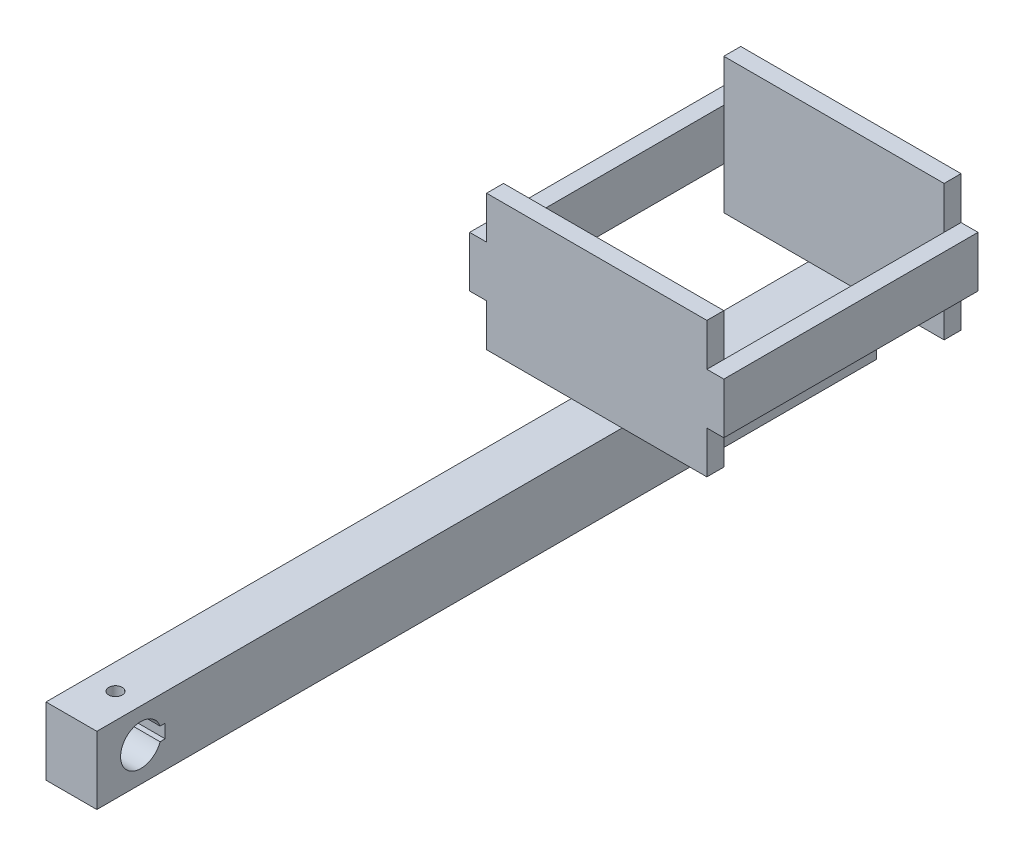
ISO-10303-21;
HEADER;
FILE_DESCRIPTION(('STEP AP214'),'2;1');
FILE_NAME('part.step','',(''),(''),'','','');
FILE_SCHEMA(('AUTOMOTIVE_DESIGN { 1 0 10303 214 1 1 1 1 }'));
ENDSEC;
DATA;
#1=APPLICATION_CONTEXT('core data for automotive mechanical design processes');
#2=APPLICATION_PROTOCOL_DEFINITION('international standard','automotive_design',2000,#1);
#3=PRODUCT_CONTEXT('',#1,'mechanical');
#4=PRODUCT('Part','Part','',(#3));
#5=PRODUCT_RELATED_PRODUCT_CATEGORY('part','',(#4));
#6=PRODUCT_DEFINITION_FORMATION('','',#4);
#7=PRODUCT_DEFINITION_CONTEXT('part definition',#1,'design');
#8=PRODUCT_DEFINITION('design','',#6,#7);
#9=PRODUCT_DEFINITION_SHAPE('','',#8);
#10=(LENGTH_UNIT() NAMED_UNIT(*) SI_UNIT(.MILLI.,.METRE.));
#11=(NAMED_UNIT(*) PLANE_ANGLE_UNIT() SI_UNIT($,.RADIAN.));
#12=(NAMED_UNIT(*) SI_UNIT($,.STERADIAN.) SOLID_ANGLE_UNIT());
#13=UNCERTAINTY_MEASURE_WITH_UNIT(LENGTH_MEASURE(1.E-05),#10,'distance_accuracy_value','');
#14=(GEOMETRIC_REPRESENTATION_CONTEXT(3) GLOBAL_UNCERTAINTY_ASSIGNED_CONTEXT((#13)) GLOBAL_UNIT_ASSIGNED_CONTEXT((#10,
#11,#12)) REPRESENTATION_CONTEXT('',''));
#15=CARTESIAN_POINT('',(0.,0.,0.));
#16=DIRECTION('',(0.,0.,1.));
#17=DIRECTION('',(1.,0.,0.));
#18=AXIS2_PLACEMENT_3D('',#15,#16,#17);
#19=CARTESIAN_POINT('',(-7.5,10.,230.));
#20=DIRECTION('',(0.,-1.,0.));
#21=DIRECTION('',(0.,0.,-1.));
#22=AXIS2_PLACEMENT_3D('',#19,#20,#21);
#23=PLANE('',#22);
#24=DIRECTION('',(1.,0.,0.));
#25=VECTOR('',#24,1.);
#26=CARTESIAN_POINT('',(-32.5,10.,70.));
#27=LINE('',#26,#25);
#28=CARTESIAN_POINT('',(-7.5,10.,70.));
#29=VERTEX_POINT('',#28);
#30=CARTESIAN_POINT('',(7.5,10.,70.));
#31=VERTEX_POINT('',#30);
#32=EDGE_CURVE('E311',#29,#31,#27,.T.);
#33=ORIENTED_EDGE('',*,*,#32,.T.);
#34=DIRECTION('',(0.,0.,-1.));
#35=VECTOR('',#34,1.);
#36=CARTESIAN_POINT('',(7.5,10.,230.));
#37=LINE('',#36,#35);
#38=CARTESIAN_POINT('',(7.5,10.,5.));
#39=VERTEX_POINT('',#38);
#40=EDGE_CURVE('E533',#31,#39,#37,.T.);
#41=ORIENTED_EDGE('',*,*,#40,.T.);
#42=DIRECTION('',(-1.,0.,0.));
#43=VECTOR('',#42,1.);
#44=CARTESIAN_POINT('',(32.5,10.,5.));
#45=LINE('',#44,#43);
#46=CARTESIAN_POINT('',(-7.5,10.,5.));
#47=VERTEX_POINT('',#46);
#48=EDGE_CURVE('E450',#39,#47,#45,.T.);
#49=ORIENTED_EDGE('',*,*,#48,.T.);
#50=DIRECTION('',(0.,0.,-1.));
#51=VECTOR('',#50,1.);
#52=CARTESIAN_POINT('',(-7.5,10.,230.));
#53=LINE('',#52,#51);
#54=EDGE_CURVE('E529',#29,#47,#53,.T.);
#55=ORIENTED_EDGE('',*,*,#54,.F.);
#56=EDGE_LOOP('',(#33,#41,#49,#55));
#57=FACE_BOUND('',#56,.T.);
#58=ADVANCED_FACE('F39',(#57),#23,.F.);
#59=CARTESIAN_POINT('',(32.5,0.,0.));
#60=DIRECTION('',(-1.,0.,0.));
#61=DIRECTION('',(0.,-1.,0.));
#62=AXIS2_PLACEMENT_3D('',#59,#60,#61);
#63=PLANE('',#62);
#64=DIRECTION('',(0.,0.,-1.));
#65=VECTOR('',#64,1.);
#66=CARTESIAN_POINT('',(32.5,22.5,0.));
#67=LINE('',#66,#65);
#68=CARTESIAN_POINT('',(32.5,22.5,70.));
#69=VERTEX_POINT('',#68);
#70=CARTESIAN_POINT('',(32.5,22.5,5.));
#71=VERTEX_POINT('',#70);
#72=EDGE_CURVE('E418',#69,#71,#67,.T.);
#73=ORIENTED_EDGE('',*,*,#72,.F.);
#74=DIRECTION('',(0.,1.,0.));
#75=VECTOR('',#74,1.);
#76=CARTESIAN_POINT('',(32.5,50.,70.));
#77=LINE('',#76,#75);
#78=CARTESIAN_POINT('',(32.5,37.5,70.));
#79=VERTEX_POINT('',#78);
#80=EDGE_CURVE('E317',#69,#79,#77,.T.);
#81=ORIENTED_EDGE('',*,*,#80,.T.);
#82=DIRECTION('',(0.,0.,1.));
#83=VECTOR('',#82,1.);
#84=CARTESIAN_POINT('',(32.5,37.5,0.));
#85=LINE('',#84,#83);
#86=CARTESIAN_POINT('',(32.5,37.5,5.));
#87=VERTEX_POINT('',#86);
#88=EDGE_CURVE('E419',#87,#79,#85,.T.);
#89=ORIENTED_EDGE('',*,*,#88,.F.);
#90=DIRECTION('',(0.,-1.,0.));
#91=VECTOR('',#90,1.);
#92=CARTESIAN_POINT('',(32.5,10.,5.));
#93=LINE('',#92,#91);
#94=EDGE_CURVE('E443',#87,#71,#93,.T.);
#95=ORIENTED_EDGE('',*,*,#94,.T.);
#96=EDGE_LOOP('',(#73,#81,#89,#95));
#97=FACE_BOUND('',#96,.T.);
#98=ADVANCED_FACE('F705',(#97),#63,.T.);
#99=CARTESIAN_POINT('',(-32.5,0.,0.));
#100=DIRECTION('',(-1.,0.,0.));
#101=DIRECTION('',(0.,0.,1.));
#102=AXIS2_PLACEMENT_3D('',#99,#100,#101);
#103=PLANE('',#102);
#104=DIRECTION('',(0.,-1.,0.));
#105=VECTOR('',#104,1.);
#106=CARTESIAN_POINT('',(-32.5,50.,70.));
#107=LINE('',#106,#105);
#108=CARTESIAN_POINT('',(-32.5,37.5,70.));
#109=VERTEX_POINT('',#108);
#110=CARTESIAN_POINT('',(-32.5,22.5,70.));
#111=VERTEX_POINT('',#110);
#112=EDGE_CURVE('E305',#109,#111,#107,.T.);
#113=ORIENTED_EDGE('',*,*,#112,.T.);
#114=DIRECTION('',(0.,0.,1.));
#115=VECTOR('',#114,1.);
#116=CARTESIAN_POINT('',(-32.5,22.5,0.));
#117=LINE('',#116,#115);
#118=CARTESIAN_POINT('',(-32.5,22.5,5.));
#119=VERTEX_POINT('',#118);
#120=EDGE_CURVE('E362',#119,#111,#117,.T.);
#121=ORIENTED_EDGE('',*,*,#120,.F.);
#122=DIRECTION('',(0.,1.,0.));
#123=VECTOR('',#122,1.);
#124=CARTESIAN_POINT('',(-32.5,10.,5.));
#125=LINE('',#124,#123);
#126=CARTESIAN_POINT('',(-32.5,37.5,5.));
#127=VERTEX_POINT('',#126);
#128=EDGE_CURVE('E455',#119,#127,#125,.T.);
#129=ORIENTED_EDGE('',*,*,#128,.T.);
#130=DIRECTION('',(0.,0.,-1.));
#131=VECTOR('',#130,1.);
#132=CARTESIAN_POINT('',(-32.5,37.5,0.));
#133=LINE('',#132,#131);
#134=EDGE_CURVE('E57',#109,#127,#133,.T.);
#135=ORIENTED_EDGE('',*,*,#134,.F.);
#136=EDGE_LOOP('',(#113,#121,#129,#135));
#137=FACE_BOUND('',#136,.T.);
#138=ADVANCED_FACE('F629',(#137),#103,.F.);
#139=CARTESIAN_POINT('',(-32.5,10.,5.));
#140=DIRECTION('',(-1.,0.,0.));
#141=DIRECTION('',(0.,0.,1.));
#142=AXIS2_PLACEMENT_3D('',#139,#140,#141);
#143=PLANE('',#142);
#144=CARTESIAN_POINT('',(-32.5,37.5,0.));
#145=VERTEX_POINT('',#144);
#146=EDGE_CURVE('E11',#127,#145,#133,.T.);
#147=ORIENTED_EDGE('',*,*,#146,.F.);
#148=CARTESIAN_POINT('',(-32.5,50.,5.));
#149=VERTEX_POINT('',#148);
#150=EDGE_CURVE('E449',#127,#149,#125,.T.);
#151=ORIENTED_EDGE('',*,*,#150,.T.);
#152=DIRECTION('',(0.,0.,-1.));
#153=VECTOR('',#152,1.);
#154=CARTESIAN_POINT('',(-32.5,50.,5.));
#155=LINE('',#154,#153);
#156=CARTESIAN_POINT('',(-32.5,50.,0.));
#157=VERTEX_POINT('',#156);
#158=EDGE_CURVE('E482',#149,#157,#155,.T.);
#159=ORIENTED_EDGE('',*,*,#158,.T.);
#160=DIRECTION('',(0.,1.,0.));
#161=VECTOR('',#160,1.);
#162=CARTESIAN_POINT('',(-32.5,10.,0.));
#163=LINE('',#162,#161);
#164=EDGE_CURVE('E469',#145,#157,#163,.T.);
#165=ORIENTED_EDGE('',*,*,#164,.F.);
#166=EDGE_LOOP('',(#147,#151,#159,#165));
#167=FACE_BOUND('',#166,.T.);
#168=ADVANCED_FACE('F640',(#167),#143,.T.);
#169=CARTESIAN_POINT('',(32.5,10.,5.));
#170=DIRECTION('',(1.,0.,0.));
#171=DIRECTION('',(0.,1.,0.));
#172=AXIS2_PLACEMENT_3D('',#169,#170,#171);
#173=PLANE('',#172);
#174=CARTESIAN_POINT('',(32.5,22.5,0.));
#175=VERTEX_POINT('',#174);
#176=EDGE_CURVE('E54',#71,#175,#67,.T.);
#177=ORIENTED_EDGE('',*,*,#176,.F.);
#178=CARTESIAN_POINT('',(32.5,10.,5.));
#179=VERTEX_POINT('',#178);
#180=EDGE_CURVE('E444',#71,#179,#93,.T.);
#181=ORIENTED_EDGE('',*,*,#180,.T.);
#182=DIRECTION('',(0.,0.,-1.));
#183=VECTOR('',#182,1.);
#184=CARTESIAN_POINT('',(32.5,10.,5.));
#185=LINE('',#184,#183);
#186=CARTESIAN_POINT('',(32.5,10.,0.));
#187=VERTEX_POINT('',#186);
#188=EDGE_CURVE('E459',#179,#187,#185,.T.);
#189=ORIENTED_EDGE('',*,*,#188,.T.);
#190=DIRECTION('',(0.,-1.,0.));
#191=VECTOR('',#190,1.);
#192=CARTESIAN_POINT('',(32.5,10.,0.));
#193=LINE('',#192,#191);
#194=EDGE_CURVE('E438',#175,#187,#193,.T.);
#195=ORIENTED_EDGE('',*,*,#194,.F.);
#196=EDGE_LOOP('',(#177,#181,#189,#195));
#197=FACE_BOUND('',#196,.T.);
#198=ADVANCED_FACE('F703',(#197),#173,.T.);
#199=CARTESIAN_POINT('',(7.5,10.,230.));
#200=DIRECTION('',(-1.,0.,0.));
#201=DIRECTION('',(0.,-1.,0.));
#202=AXIS2_PLACEMENT_3D('',#199,#200,#201);
#203=PLANE('',#202);
#204=DIRECTION('',(0.,0.,1.));
#205=VECTOR('',#204,1.);
#206=CARTESIAN_POINT('',(7.5,-2.,230.));
#207=LINE('',#206,#205);
#208=CARTESIAN_POINT('',(7.5,-2.,209.843145750508));
#209=VERTEX_POINT('',#208);
#210=CARTESIAN_POINT('',(7.5,-2.,211.343145750508));
#211=VERTEX_POINT('',#210);
#212=EDGE_CURVE('E292',#209,#211,#207,.T.);
#213=ORIENTED_EDGE('',*,*,#212,.T.);
#214=CARTESIAN_POINT('',(7.5,0.,217.));
#215=DIRECTION('',(-1.,0.,0.));
#216=DIRECTION('',(0.,-1.,0.));
#217=AXIS2_PLACEMENT_3D('',#214,#215,#216);
#218=CIRCLE('',#217,6.00000000000001);
#219=CARTESIAN_POINT('',(7.5,2.,211.343145750508));
#220=VERTEX_POINT('',#219);
#221=EDGE_CURVE('E296',#211,#220,#218,.T.);
#222=ORIENTED_EDGE('',*,*,#221,.T.);
#223=DIRECTION('',(0.,0.,-1.));
#224=VECTOR('',#223,1.);
#225=CARTESIAN_POINT('',(7.5,2.,230.));
#226=LINE('',#225,#224);
#227=CARTESIAN_POINT('',(7.5,2.,209.843145750508));
#228=VERTEX_POINT('',#227);
#229=EDGE_CURVE('E283',#220,#228,#226,.T.);
#230=ORIENTED_EDGE('',*,*,#229,.T.);
#231=DIRECTION('',(0.,-1.,0.));
#232=VECTOR('',#231,1.);
#233=CARTESIAN_POINT('',(7.5,10.,209.843145750508));
#234=LINE('',#233,#232);
#235=EDGE_CURVE('E258',#228,#209,#234,.T.);
#236=ORIENTED_EDGE('',*,*,#235,.T.);
#237=EDGE_LOOP('',(#213,#222,#230,#236));
#238=FACE_BOUND('',#237,.T.);
#239=DIRECTION('',(0.,1.,0.));
#240=VECTOR('',#239,1.);
#241=CARTESIAN_POINT('',(7.5,10.,0.));
#242=LINE('',#241,#240);
#243=CARTESIAN_POINT('',(7.5,-10.,0.));
#244=VERTEX_POINT('',#243);
#245=CARTESIAN_POINT('',(7.5,10.,0.));
#246=VERTEX_POINT('',#245);
#247=EDGE_CURVE('E481',#244,#246,#242,.T.);
#248=ORIENTED_EDGE('',*,*,#247,.T.);
#249=EDGE_CURVE('E527',#39,#246,#37,.T.);
#250=ORIENTED_EDGE('',*,*,#249,.F.);
#251=ORIENTED_EDGE('',*,*,#40,.F.);
#252=DIRECTION('',(0.,0.,1.));
#253=VECTOR('',#252,1.);
#254=CARTESIAN_POINT('',(7.5,10.,230.));
#255=LINE('',#254,#253);
#256=CARTESIAN_POINT('',(7.5,10.,75.));
#257=VERTEX_POINT('',#256);
#258=EDGE_CURVE('E358',#31,#257,#255,.T.);
#259=ORIENTED_EDGE('',*,*,#258,.T.);
#260=CARTESIAN_POINT('',(7.5,10.,230.));
#261=VERTEX_POINT('',#260);
#262=EDGE_CURVE('E530',#261,#257,#37,.T.);
#263=ORIENTED_EDGE('',*,*,#262,.F.);
#264=DIRECTION('',(0.,1.,0.));
#265=VECTOR('',#264,1.);
#266=CARTESIAN_POINT('',(7.5,10.,230.));
#267=LINE('',#266,#265);
#268=CARTESIAN_POINT('',(7.5,-10.,230.));
#269=VERTEX_POINT('',#268);
#270=EDGE_CURVE('E493',#269,#261,#267,.T.);
#271=ORIENTED_EDGE('',*,*,#270,.F.);
#272=DIRECTION('',(0.,0.,-1.));
#273=VECTOR('',#272,1.);
#274=CARTESIAN_POINT('',(7.5,-10.,230.));
#275=LINE('',#274,#273);
#276=EDGE_CURVE('E507',#269,#244,#275,.T.);
#277=ORIENTED_EDGE('',*,*,#276,.T.);
#278=EDGE_LOOP('',(#248,#250,#251,#259,#263,#271,#277));
#279=FACE_BOUND('',#278,.T.);
#280=ADVANCED_FACE('F41',(#238,#279),#203,.F.);
#281=CARTESIAN_POINT('',(0.,10.,217.));
#282=DIRECTION('',(0.,1.,0.));
#283=DIRECTION('',(0.,0.,1.));
#284=AXIS2_PLACEMENT_3D('',#281,#282,#283);
#285=CIRCLE('',#284,1.984375);
#286=CARTESIAN_POINT('',(0.,10.,218.984375));
#287=VERTEX_POINT('',#286);
#288=EDGE_CURVE('E721',#287,#287,#285,.T.);
#289=ORIENTED_EDGE('',*,*,#288,.F.);
#290=EDGE_LOOP('',(#289));
#291=FACE_BOUND('',#290,.T.);
#292=ORIENTED_EDGE('',*,*,#262,.T.);
#293=DIRECTION('',(1.,0.,0.));
#294=VECTOR('',#293,1.);
#295=CARTESIAN_POINT('',(-32.5,10.,75.));
#296=LINE('',#295,#294);
#297=CARTESIAN_POINT('',(-7.5,10.,75.));
#298=VERTEX_POINT('',#297);
#299=EDGE_CURVE('E332',#298,#257,#296,.T.);
#300=ORIENTED_EDGE('',*,*,#299,.F.);
#301=CARTESIAN_POINT('',(-7.5,10.,230.));
#302=VERTEX_POINT('',#301);
#303=EDGE_CURVE('E524',#302,#298,#53,.T.);
#304=ORIENTED_EDGE('',*,*,#303,.F.);
#305=DIRECTION('',(-1.,0.,0.));
#306=VECTOR('',#305,1.);
#307=CARTESIAN_POINT('',(-7.5,10.,230.));
#308=LINE('',#307,#306);
#309=EDGE_CURVE('E497',#261,#302,#308,.T.);
#310=ORIENTED_EDGE('',*,*,#309,.F.);
#311=EDGE_LOOP('',(#292,#300,#304,#310));
#312=FACE_BOUND('',#311,.T.);
#313=ADVANCED_FACE('F580',(#291,#312),#23,.F.);
#314=CARTESIAN_POINT('',(-7.5,10.,230.));
#315=DIRECTION('',(1.,0.,0.));
#316=DIRECTION('',(0.,1.,0.));
#317=AXIS2_PLACEMENT_3D('',#314,#315,#316);
#318=PLANE('',#317);
#319=DIRECTION('',(0.,0.,-1.));
#320=VECTOR('',#319,1.);
#321=CARTESIAN_POINT('',(-7.5,2.,209.843145750508));
#322=LINE('',#321,#320);
#323=CARTESIAN_POINT('',(-7.5,1.99999999999999,211.343145750508));
#324=VERTEX_POINT('',#323);
#325=CARTESIAN_POINT('',(-7.5,2.,209.843145750508));
#326=VERTEX_POINT('',#325);
#327=EDGE_CURVE('E265',#324,#326,#322,.T.);
#328=ORIENTED_EDGE('',*,*,#327,.F.);
#329=CARTESIAN_POINT('',(-7.5,0.,217.));
#330=DIRECTION('',(-1.,0.,0.));
#331=DIRECTION('',(0.,-1.,0.));
#332=AXIS2_PLACEMENT_3D('',#329,#330,#331);
#333=CIRCLE('',#332,6.00000000000001);
#334=CARTESIAN_POINT('',(-7.5,-2.,211.343145750508));
#335=VERTEX_POINT('',#334);
#336=EDGE_CURVE('E72',#335,#324,#333,.T.);
#337=ORIENTED_EDGE('',*,*,#336,.F.);
#338=DIRECTION('',(0.,0.,1.));
#339=VECTOR('',#338,1.);
#340=CARTESIAN_POINT('',(-7.5,-2.,209.843145750508));
#341=LINE('',#340,#339);
#342=CARTESIAN_POINT('',(-7.5,-2.,209.843145750508));
#343=VERTEX_POINT('',#342);
#344=EDGE_CURVE('E273',#343,#335,#341,.T.);
#345=ORIENTED_EDGE('',*,*,#344,.F.);
#346=DIRECTION('',(0.,-1.,0.));
#347=VECTOR('',#346,1.);
#348=CARTESIAN_POINT('',(-7.5,2.,209.843145750508));
#349=LINE('',#348,#347);
#350=EDGE_CURVE('E255',#326,#343,#349,.T.);
#351=ORIENTED_EDGE('',*,*,#350,.F.);
#352=EDGE_LOOP('',(#328,#337,#345,#351));
#353=FACE_BOUND('',#352,.T.);
#354=DIRECTION('',(0.,-1.,0.));
#355=VECTOR('',#354,1.);
#356=CARTESIAN_POINT('',(-7.5,10.,0.));
#357=LINE('',#356,#355);
#358=CARTESIAN_POINT('',(-7.50000000000001,10.,0.));
#359=VERTEX_POINT('',#358);
#360=CARTESIAN_POINT('',(-7.5,-10.,0.));
#361=VERTEX_POINT('',#360);
#362=EDGE_CURVE('E511',#359,#361,#357,.T.);
#363=ORIENTED_EDGE('',*,*,#362,.T.);
#364=DIRECTION('',(0.,0.,-1.));
#365=VECTOR('',#364,1.);
#366=CARTESIAN_POINT('',(-7.5,-10.,230.));
#367=LINE('',#366,#365);
#368=CARTESIAN_POINT('',(-7.5,-10.,230.));
#369=VERTEX_POINT('',#368);
#370=EDGE_CURVE('E519',#369,#361,#367,.T.);
#371=ORIENTED_EDGE('',*,*,#370,.F.);
#372=DIRECTION('',(0.,-1.,0.));
#373=VECTOR('',#372,1.);
#374=CARTESIAN_POINT('',(-7.5,10.,230.));
#375=LINE('',#374,#373);
#376=EDGE_CURVE('E501',#302,#369,#375,.T.);
#377=ORIENTED_EDGE('',*,*,#376,.F.);
#378=ORIENTED_EDGE('',*,*,#303,.T.);
#379=EDGE_CURVE('E528',#298,#29,#53,.T.);
#380=ORIENTED_EDGE('',*,*,#379,.T.);
#381=ORIENTED_EDGE('',*,*,#54,.T.);
#382=EDGE_CURVE('E523',#47,#359,#53,.T.);
#383=ORIENTED_EDGE('',*,*,#382,.T.);
#384=EDGE_LOOP('',(#363,#371,#377,#378,#380,#381,#383));
#385=FACE_BOUND('',#384,.T.);
#386=ADVANCED_FACE('F270',(#353,#385),#318,.F.);
#387=CARTESIAN_POINT('',(-7.5,-10.,230.));
#388=DIRECTION('',(0.,1.,0.));
#389=DIRECTION('',(0.,0.,1.));
#390=AXIS2_PLACEMENT_3D('',#387,#388,#389);
#391=PLANE('',#390);
#392=DIRECTION('',(1.,0.,0.));
#393=VECTOR('',#392,1.);
#394=CARTESIAN_POINT('',(-7.5,-10.,0.));
#395=LINE('',#394,#393);
#396=EDGE_CURVE('E498',#361,#244,#395,.T.);
#397=ORIENTED_EDGE('',*,*,#396,.T.);
#398=ORIENTED_EDGE('',*,*,#276,.F.);
#399=DIRECTION('',(1.,0.,0.));
#400=VECTOR('',#399,1.);
#401=CARTESIAN_POINT('',(-7.5,-10.,230.));
#402=LINE('',#401,#400);
#403=EDGE_CURVE('E504',#369,#269,#402,.T.);
#404=ORIENTED_EDGE('',*,*,#403,.F.);
#405=ORIENTED_EDGE('',*,*,#370,.T.);
#406=EDGE_LOOP('',(#397,#398,#404,#405));
#407=FACE_BOUND('',#406,.T.);
#408=ADVANCED_FACE('F557',(#407),#391,.F.);
#409=CARTESIAN_POINT('',(0.,0.,230.));
#410=DIRECTION('',(0.,0.,1.));
#411=DIRECTION('',(1.,0.,0.));
#412=AXIS2_PLACEMENT_3D('',#409,#410,#411);
#413=PLANE('',#412);
#414=ORIENTED_EDGE('',*,*,#270,.T.);
#415=ORIENTED_EDGE('',*,*,#309,.T.);
#416=ORIENTED_EDGE('',*,*,#376,.T.);
#417=ORIENTED_EDGE('',*,*,#403,.T.);
#418=EDGE_LOOP('',(#414,#415,#416,#417));
#419=FACE_BOUND('',#418,.T.);
#420=ADVANCED_FACE('F885',(#419),#413,.T.);
#421=CARTESIAN_POINT('',(0.,0.,0.));
#422=DIRECTION('',(0.,0.,1.));
#423=DIRECTION('',(1.,0.,0.));
#424=AXIS2_PLACEMENT_3D('',#421,#422,#423);
#425=PLANE('',#424);
#426=ORIENTED_EDGE('',*,*,#247,.F.);
#427=ORIENTED_EDGE('',*,*,#396,.F.);
#428=ORIENTED_EDGE('',*,*,#362,.F.);
#429=DIRECTION('',(-1.,0.,0.));
#430=VECTOR('',#429,1.);
#431=CARTESIAN_POINT('',(32.5,10.,0.));
#432=LINE('',#431,#430);
#433=CARTESIAN_POINT('',(-32.5,10.,0.));
#434=VERTEX_POINT('',#433);
#435=EDGE_CURVE('E464',#359,#434,#432,.T.);
#436=ORIENTED_EDGE('',*,*,#435,.T.);
#437=CARTESIAN_POINT('',(-32.5,22.5,0.));
#438=VERTEX_POINT('',#437);
#439=EDGE_CURVE('E470',#434,#438,#163,.T.);
#440=ORIENTED_EDGE('',*,*,#439,.T.);
#441=DIRECTION('',(1.,0.,0.));
#442=VECTOR('',#441,1.);
#443=CARTESIAN_POINT('',(-37.5,22.5,0.));
#444=LINE('',#443,#442);
#445=CARTESIAN_POINT('',(-37.5,22.5,0.));
#446=VERTEX_POINT('',#445);
#447=EDGE_CURVE('E394',#446,#438,#444,.T.);
#448=ORIENTED_EDGE('',*,*,#447,.F.);
#449=DIRECTION('',(0.,-1.,0.));
#450=VECTOR('',#449,1.);
#451=CARTESIAN_POINT('',(-37.5,37.5,0.));
#452=LINE('',#451,#450);
#453=CARTESIAN_POINT('',(-37.5,37.5,0.));
#454=VERTEX_POINT('',#453);
#455=EDGE_CURVE('E363',#454,#446,#452,.T.);
#456=ORIENTED_EDGE('',*,*,#455,.F.);
#457=DIRECTION('',(1.,0.,0.));
#458=VECTOR('',#457,1.);
#459=CARTESIAN_POINT('',(-37.5,37.5,0.));
#460=LINE('',#459,#458);
#461=EDGE_CURVE('E376',#454,#145,#460,.T.);
#462=ORIENTED_EDGE('',*,*,#461,.T.);
#463=ORIENTED_EDGE('',*,*,#164,.T.);
#464=DIRECTION('',(1.,0.,0.));
#465=VECTOR('',#464,1.);
#466=CARTESIAN_POINT('',(32.5,50.,0.));
#467=LINE('',#466,#465);
#468=CARTESIAN_POINT('',(32.5,50.,0.));
#469=VERTEX_POINT('',#468);
#470=EDGE_CURVE('E474',#157,#469,#467,.T.);
#471=ORIENTED_EDGE('',*,*,#470,.T.);
#472=CARTESIAN_POINT('',(32.5,37.5,0.));
#473=VERTEX_POINT('',#472);
#474=EDGE_CURVE('E460',#469,#473,#193,.T.);
#475=ORIENTED_EDGE('',*,*,#474,.T.);
#476=DIRECTION('',(-1.,0.,0.));
#477=VECTOR('',#476,1.);
#478=CARTESIAN_POINT('',(37.5,37.5,0.));
#479=LINE('',#478,#477);
#480=CARTESIAN_POINT('',(37.5,37.5,0.));
#481=VERTEX_POINT('',#480);
#482=EDGE_CURVE('E434',#481,#473,#479,.T.);
#483=ORIENTED_EDGE('',*,*,#482,.F.);
#484=DIRECTION('',(0.,1.,0.));
#485=VECTOR('',#484,1.);
#486=CARTESIAN_POINT('',(37.5,37.5,0.));
#487=LINE('',#486,#485);
#488=CARTESIAN_POINT('',(37.5,22.5,0.));
#489=VERTEX_POINT('',#488);
#490=EDGE_CURVE('E399',#489,#481,#487,.T.);
#491=ORIENTED_EDGE('',*,*,#490,.F.);
#492=DIRECTION('',(-1.,0.,0.));
#493=VECTOR('',#492,1.);
#494=CARTESIAN_POINT('',(37.5,22.5,0.));
#495=LINE('',#494,#493);
#496=EDGE_CURVE('E413',#489,#175,#495,.T.);
#497=ORIENTED_EDGE('',*,*,#496,.T.);
#498=ORIENTED_EDGE('',*,*,#194,.T.);
#499=EDGE_CURVE('E465',#187,#246,#432,.T.);
#500=ORIENTED_EDGE('',*,*,#499,.T.);
#501=EDGE_LOOP('',(#426,#427,#428,#436,#440,#448,#456,#462,#463,#471,#475,#483,#491,#497,#498,#500));
#502=FACE_BOUND('',#501,.T.);
#503=ADVANCED_FACE('F551',(#502),#425,.F.);
#504=CARTESIAN_POINT('',(32.5,10.,5.));
#505=DIRECTION('',(0.,-1.,0.));
#506=DIRECTION('',(1.,0.,0.));
#507=AXIS2_PLACEMENT_3D('',#504,#505,#506);
#508=PLANE('',#507);
#509=ORIENTED_EDGE('',*,*,#382,.F.);
#510=CARTESIAN_POINT('',(-32.5,10.,5.));
#511=VERTEX_POINT('',#510);
#512=EDGE_CURVE('E442',#47,#511,#45,.T.);
#513=ORIENTED_EDGE('',*,*,#512,.T.);
#514=DIRECTION('',(0.,0.,-1.));
#515=VECTOR('',#514,1.);
#516=CARTESIAN_POINT('',(-32.5,10.,5.));
#517=LINE('',#516,#515);
#518=EDGE_CURVE('E486',#511,#434,#517,.T.);
#519=ORIENTED_EDGE('',*,*,#518,.T.);
#520=ORIENTED_EDGE('',*,*,#435,.F.);
#521=EDGE_LOOP('',(#509,#513,#519,#520));
#522=FACE_BOUND('',#521,.T.);
#523=ADVANCED_FACE('F689',(#522),#508,.T.);
#524=EDGE_CURVE('E414',#473,#87,#85,.T.);
#525=ORIENTED_EDGE('',*,*,#524,.F.);
#526=ORIENTED_EDGE('',*,*,#474,.F.);
#527=DIRECTION('',(0.,0.,-1.));
#528=VECTOR('',#527,1.);
#529=CARTESIAN_POINT('',(32.5,50.,5.));
#530=LINE('',#529,#528);
#531=CARTESIAN_POINT('',(32.5,50.,5.));
#532=VERTEX_POINT('',#531);
#533=EDGE_CURVE('E478',#532,#469,#530,.T.);
#534=ORIENTED_EDGE('',*,*,#533,.F.);
#535=EDGE_CURVE('E439',#532,#87,#93,.T.);
#536=ORIENTED_EDGE('',*,*,#535,.T.);
#537=EDGE_LOOP('',(#525,#526,#534,#536));
#538=FACE_BOUND('',#537,.T.);
#539=ADVANCED_FACE('F700',(#538),#173,.T.);
#540=CARTESIAN_POINT('',(32.5,50.,5.));
#541=DIRECTION('',(0.,1.,0.));
#542=DIRECTION('',(-1.,0.,0.));
#543=AXIS2_PLACEMENT_3D('',#540,#541,#542);
#544=PLANE('',#543);
#545=ORIENTED_EDGE('',*,*,#470,.F.);
#546=ORIENTED_EDGE('',*,*,#158,.F.);
#547=DIRECTION('',(1.,0.,0.));
#548=VECTOR('',#547,1.);
#549=CARTESIAN_POINT('',(32.5,50.,5.));
#550=LINE('',#549,#548);
#551=EDGE_CURVE('E454',#149,#532,#550,.T.);
#552=ORIENTED_EDGE('',*,*,#551,.T.);
#553=ORIENTED_EDGE('',*,*,#533,.T.);
#554=EDGE_LOOP('',(#545,#546,#552,#553));
#555=FACE_BOUND('',#554,.T.);
#556=ADVANCED_FACE('F643',(#555),#544,.T.);
#557=EDGE_CURVE('E377',#438,#119,#117,.T.);
#558=ORIENTED_EDGE('',*,*,#557,.F.);
#559=ORIENTED_EDGE('',*,*,#439,.F.);
#560=ORIENTED_EDGE('',*,*,#518,.F.);
#561=EDGE_CURVE('E451',#511,#119,#125,.T.);
#562=ORIENTED_EDGE('',*,*,#561,.T.);
#563=EDGE_LOOP('',(#558,#559,#560,#562));
#564=FACE_BOUND('',#563,.T.);
#565=ADVANCED_FACE('F692',(#564),#143,.T.);
#566=EDGE_CURVE('E445',#179,#39,#45,.T.);
#567=ORIENTED_EDGE('',*,*,#566,.T.);
#568=ORIENTED_EDGE('',*,*,#249,.T.);
#569=ORIENTED_EDGE('',*,*,#499,.F.);
#570=ORIENTED_EDGE('',*,*,#188,.F.);
#571=EDGE_LOOP('',(#567,#568,#569,#570));
#572=FACE_BOUND('',#571,.T.);
#573=ADVANCED_FACE('F544',(#572),#508,.T.);
#574=CARTESIAN_POINT('',(0.,0.,5.));
#575=DIRECTION('',(0.,0.,1.));
#576=DIRECTION('',(1.,0.,0.));
#577=AXIS2_PLACEMENT_3D('',#574,#575,#576);
#578=PLANE('',#577);
#579=ORIENTED_EDGE('',*,*,#535,.F.);
#580=ORIENTED_EDGE('',*,*,#551,.F.);
#581=ORIENTED_EDGE('',*,*,#150,.F.);
#582=ORIENTED_EDGE('',*,*,#128,.F.);
#583=ORIENTED_EDGE('',*,*,#561,.F.);
#584=ORIENTED_EDGE('',*,*,#512,.F.);
#585=ORIENTED_EDGE('',*,*,#48,.F.);
#586=ORIENTED_EDGE('',*,*,#566,.F.);
#587=ORIENTED_EDGE('',*,*,#180,.F.);
#588=ORIENTED_EDGE('',*,*,#94,.F.);
#589=EDGE_LOOP('',(#579,#580,#581,#582,#583,#584,#585,#586,#587,#588));
#590=FACE_BOUND('',#589,.T.);
#591=ADVANCED_FACE('F635',(#590),#578,.T.);
#592=CARTESIAN_POINT('',(37.5,37.5,0.));
#593=DIRECTION('',(0.,-1.,0.));
#594=DIRECTION('',(1.,0.,0.));
#595=AXIS2_PLACEMENT_3D('',#592,#593,#594);
#596=PLANE('',#595);
#597=ORIENTED_EDGE('',*,*,#524,.T.);
#598=ORIENTED_EDGE('',*,*,#88,.T.);
#599=CARTESIAN_POINT('',(32.5,37.5,75.));
#600=VERTEX_POINT('',#599);
#601=EDGE_CURVE('E398',#79,#600,#85,.T.);
#602=ORIENTED_EDGE('',*,*,#601,.T.);
#603=DIRECTION('',(-1.,0.,0.));
#604=VECTOR('',#603,1.);
#605=CARTESIAN_POINT('',(37.5,37.5,75.));
#606=LINE('',#605,#604);
#607=CARTESIAN_POINT('',(37.5,37.5,75.));
#608=VERTEX_POINT('',#607);
#609=EDGE_CURVE('E430',#608,#600,#606,.T.);
#610=ORIENTED_EDGE('',*,*,#609,.F.);
#611=DIRECTION('',(0.,0.,1.));
#612=VECTOR('',#611,1.);
#613=CARTESIAN_POINT('',(37.5,37.5,0.));
#614=LINE('',#613,#612);
#615=EDGE_CURVE('E403',#481,#608,#614,.T.);
#616=ORIENTED_EDGE('',*,*,#615,.F.);
#617=ORIENTED_EDGE('',*,*,#482,.T.);
#618=EDGE_LOOP('',(#597,#598,#602,#610,#616,#617));
#619=FACE_BOUND('',#618,.T.);
#620=ADVANCED_FACE('F606',(#619),#596,.F.);
#621=CARTESIAN_POINT('',(37.5,37.5,75.));
#622=DIRECTION('',(0.,0.,-1.));
#623=DIRECTION('',(-1.,0.,0.));
#624=AXIS2_PLACEMENT_3D('',#621,#622,#623);
#625=PLANE('',#624);
#626=ORIENTED_EDGE('',*,*,#609,.T.);
#627=DIRECTION('',(0.,1.,0.));
#628=VECTOR('',#627,1.);
#629=CARTESIAN_POINT('',(32.5,50.,75.));
#630=LINE('',#629,#628);
#631=CARTESIAN_POINT('',(32.5,50.,75.));
#632=VERTEX_POINT('',#631);
#633=EDGE_CURVE('E331',#600,#632,#630,.T.);
#634=ORIENTED_EDGE('',*,*,#633,.T.);
#635=DIRECTION('',(-1.,0.,0.));
#636=VECTOR('',#635,1.);
#637=CARTESIAN_POINT('',(-32.5,50.,75.));
#638=LINE('',#637,#636);
#639=CARTESIAN_POINT('',(-32.5,50.,75.));
#640=VERTEX_POINT('',#639);
#641=EDGE_CURVE('E336',#632,#640,#638,.T.);
#642=ORIENTED_EDGE('',*,*,#641,.T.);
#643=DIRECTION('',(0.,-1.,0.));
#644=VECTOR('',#643,1.);
#645=CARTESIAN_POINT('',(-32.5,50.,75.));
#646=LINE('',#645,#644);
#647=CARTESIAN_POINT('',(-32.5,37.5,75.));
#648=VERTEX_POINT('',#647);
#649=EDGE_CURVE('E322',#640,#648,#646,.T.);
#650=ORIENTED_EDGE('',*,*,#649,.T.);
#651=DIRECTION('',(1.,0.,0.));
#652=VECTOR('',#651,1.);
#653=CARTESIAN_POINT('',(-37.5,37.5,75.));
#654=LINE('',#653,#652);
#655=CARTESIAN_POINT('',(-37.5,37.5,75.));
#656=VERTEX_POINT('',#655);
#657=EDGE_CURVE('E386',#656,#648,#654,.T.);
#658=ORIENTED_EDGE('',*,*,#657,.F.);
#659=DIRECTION('',(0.,1.,0.));
#660=VECTOR('',#659,1.);
#661=CARTESIAN_POINT('',(-37.5,37.5,75.));
#662=LINE('',#661,#660);
#663=CARTESIAN_POINT('',(-37.5,22.5,75.));
#664=VERTEX_POINT('',#663);
#665=EDGE_CURVE('E370',#664,#656,#662,.T.);
#666=ORIENTED_EDGE('',*,*,#665,.F.);
#667=DIRECTION('',(1.,0.,0.));
#668=VECTOR('',#667,1.);
#669=CARTESIAN_POINT('',(-37.5,22.5,75.));
#670=LINE('',#669,#668);
#671=CARTESIAN_POINT('',(-32.5,22.5,75.));
#672=VERTEX_POINT('',#671);
#673=EDGE_CURVE('E390',#664,#672,#670,.T.);
#674=ORIENTED_EDGE('',*,*,#673,.T.);
#675=CARTESIAN_POINT('',(-32.5,10.,75.));
#676=VERTEX_POINT('',#675);
#677=EDGE_CURVE('E300',#672,#676,#646,.T.);
#678=ORIENTED_EDGE('',*,*,#677,.T.);
#679=EDGE_CURVE('E327',#676,#298,#296,.T.);
#680=ORIENTED_EDGE('',*,*,#679,.T.);
#681=ORIENTED_EDGE('',*,*,#299,.T.);
#682=CARTESIAN_POINT('',(32.5,10.,75.));
#683=VERTEX_POINT('',#682);
#684=EDGE_CURVE('E326',#257,#683,#296,.T.);
#685=ORIENTED_EDGE('',*,*,#684,.T.);
#686=CARTESIAN_POINT('',(32.5,22.5,75.));
#687=VERTEX_POINT('',#686);
#688=EDGE_CURVE('E333',#683,#687,#630,.T.);
#689=ORIENTED_EDGE('',*,*,#688,.T.);
#690=DIRECTION('',(-1.,0.,0.));
#691=VECTOR('',#690,1.);
#692=CARTESIAN_POINT('',(37.5,22.5,75.));
#693=LINE('',#692,#691);
#694=CARTESIAN_POINT('',(37.5,22.5,75.));
#695=VERTEX_POINT('',#694);
#696=EDGE_CURVE('E426',#695,#687,#693,.T.);
#697=ORIENTED_EDGE('',*,*,#696,.F.);
#698=DIRECTION('',(0.,-1.,0.));
#699=VECTOR('',#698,1.);
#700=CARTESIAN_POINT('',(37.5,37.5,75.));
#701=LINE('',#700,#699);
#702=EDGE_CURVE('E407',#608,#695,#701,.T.);
#703=ORIENTED_EDGE('',*,*,#702,.F.);
#704=EDGE_LOOP('',(#626,#634,#642,#650,#658,#666,#674,#678,#680,#681,#685,#689,#697,#703));
#705=FACE_BOUND('',#704,.T.);
#706=ADVANCED_FACE('F579',(#705),#625,.F.);
#707=CARTESIAN_POINT('',(37.5,22.5,0.));
#708=DIRECTION('',(0.,1.,0.));
#709=DIRECTION('',(-1.,0.,0.));
#710=AXIS2_PLACEMENT_3D('',#707,#708,#709);
#711=PLANE('',#710);
#712=EDGE_CURVE('E404',#687,#69,#67,.T.);
#713=ORIENTED_EDGE('',*,*,#712,.T.);
#714=ORIENTED_EDGE('',*,*,#72,.T.);
#715=ORIENTED_EDGE('',*,*,#176,.T.);
#716=ORIENTED_EDGE('',*,*,#496,.F.);
#717=DIRECTION('',(0.,0.,-1.));
#718=VECTOR('',#717,1.);
#719=CARTESIAN_POINT('',(37.5,22.5,0.));
#720=LINE('',#719,#718);
#721=EDGE_CURVE('E410',#695,#489,#720,.T.);
#722=ORIENTED_EDGE('',*,*,#721,.F.);
#723=ORIENTED_EDGE('',*,*,#696,.T.);
#724=EDGE_LOOP('',(#713,#714,#715,#716,#722,#723));
#725=FACE_BOUND('',#724,.T.);
#726=ADVANCED_FACE('F596',(#725),#711,.F.);
#727=CARTESIAN_POINT('',(37.5,0.,0.));
#728=DIRECTION('',(-1.,0.,0.));
#729=DIRECTION('',(0.,-1.,0.));
#730=AXIS2_PLACEMENT_3D('',#727,#728,#729);
#731=PLANE('',#730);
#732=ORIENTED_EDGE('',*,*,#490,.T.);
#733=ORIENTED_EDGE('',*,*,#615,.T.);
#734=ORIENTED_EDGE('',*,*,#702,.T.);
#735=ORIENTED_EDGE('',*,*,#721,.T.);
#736=EDGE_LOOP('',(#732,#733,#734,#735));
#737=FACE_BOUND('',#736,.T.);
#738=ADVANCED_FACE('F601',(#737),#731,.F.);
#739=CARTESIAN_POINT('',(-37.5,22.5,0.));
#740=DIRECTION('',(0.,1.,0.));
#741=DIRECTION('',(0.,0.,1.));
#742=AXIS2_PLACEMENT_3D('',#739,#740,#741);
#743=PLANE('',#742);
#744=ORIENTED_EDGE('',*,*,#557,.T.);
#745=ORIENTED_EDGE('',*,*,#120,.T.);
#746=DIRECTION('',(0.,0.,1.));
#747=VECTOR('',#746,1.);
#748=CARTESIAN_POINT('',(-32.5,22.5,0.));
#749=LINE('',#748,#747);
#750=EDGE_CURVE('E343',#111,#672,#749,.T.);
#751=ORIENTED_EDGE('',*,*,#750,.T.);
#752=ORIENTED_EDGE('',*,*,#673,.F.);
#753=DIRECTION('',(0.,0.,1.));
#754=VECTOR('',#753,1.);
#755=CARTESIAN_POINT('',(-37.5,22.5,0.));
#756=LINE('',#755,#754);
#757=EDGE_CURVE('E367',#446,#664,#756,.T.);
#758=ORIENTED_EDGE('',*,*,#757,.F.);
#759=ORIENTED_EDGE('',*,*,#447,.T.);
#760=EDGE_LOOP('',(#744,#745,#751,#752,#758,#759));
#761=FACE_BOUND('',#760,.T.);
#762=ADVANCED_FACE('F678',(#761),#743,.F.);
#763=CARTESIAN_POINT('',(-37.5,37.5,0.));
#764=DIRECTION('',(0.,-1.,0.));
#765=DIRECTION('',(0.,0.,-1.));
#766=AXIS2_PLACEMENT_3D('',#763,#764,#765);
#767=PLANE('',#766);
#768=EDGE_CURVE('E56',#648,#109,#133,.T.);
#769=ORIENTED_EDGE('',*,*,#768,.T.);
#770=ORIENTED_EDGE('',*,*,#134,.T.);
#771=ORIENTED_EDGE('',*,*,#146,.T.);
#772=ORIENTED_EDGE('',*,*,#461,.F.);
#773=DIRECTION('',(0.,0.,-1.));
#774=VECTOR('',#773,1.);
#775=CARTESIAN_POINT('',(-37.5,37.5,0.));
#776=LINE('',#775,#774);
#777=EDGE_CURVE('E373',#656,#454,#776,.T.);
#778=ORIENTED_EDGE('',*,*,#777,.F.);
#779=ORIENTED_EDGE('',*,*,#657,.T.);
#780=EDGE_LOOP('',(#769,#770,#771,#772,#778,#779));
#781=FACE_BOUND('',#780,.T.);
#782=ADVANCED_FACE('F648',(#781),#767,.F.);
#783=CARTESIAN_POINT('',(-37.5,0.,0.));
#784=DIRECTION('',(-1.,0.,0.));
#785=DIRECTION('',(0.,0.,1.));
#786=AXIS2_PLACEMENT_3D('',#783,#784,#785);
#787=PLANE('',#786);
#788=ORIENTED_EDGE('',*,*,#455,.T.);
#789=ORIENTED_EDGE('',*,*,#757,.T.);
#790=ORIENTED_EDGE('',*,*,#665,.T.);
#791=ORIENTED_EDGE('',*,*,#777,.T.);
#792=EDGE_LOOP('',(#788,#789,#790,#791));
#793=FACE_BOUND('',#792,.T.);
#794=ADVANCED_FACE('F674',(#793),#787,.T.);
#795=CARTESIAN_POINT('',(-32.5,10.,70.));
#796=DIRECTION('',(0.,-1.,0.));
#797=DIRECTION('',(0.,0.,-1.));
#798=AXIS2_PLACEMENT_3D('',#795,#796,#797);
#799=PLANE('',#798);
#800=ORIENTED_EDGE('',*,*,#258,.F.);
#801=CARTESIAN_POINT('',(32.5,10.,70.));
#802=VERTEX_POINT('',#801);
#803=EDGE_CURVE('E304',#31,#802,#27,.T.);
#804=ORIENTED_EDGE('',*,*,#803,.T.);
#805=DIRECTION('',(0.,0.,1.));
#806=VECTOR('',#805,1.);
#807=CARTESIAN_POINT('',(32.5,10.,70.));
#808=LINE('',#807,#806);
#809=EDGE_CURVE('E348',#802,#683,#808,.T.);
#810=ORIENTED_EDGE('',*,*,#809,.T.);
#811=ORIENTED_EDGE('',*,*,#684,.F.);
#812=EDGE_LOOP('',(#800,#804,#810,#811));
#813=FACE_BOUND('',#812,.T.);
#814=ADVANCED_FACE('F588',(#813),#799,.T.);
#815=ORIENTED_EDGE('',*,*,#379,.F.);
#816=ORIENTED_EDGE('',*,*,#679,.F.);
#817=DIRECTION('',(0.,0.,1.));
#818=VECTOR('',#817,1.);
#819=CARTESIAN_POINT('',(-32.5,10.,70.));
#820=LINE('',#819,#818);
#821=CARTESIAN_POINT('',(-32.5,10.,70.));
#822=VERTEX_POINT('',#821);
#823=EDGE_CURVE('E321',#822,#676,#820,.T.);
#824=ORIENTED_EDGE('',*,*,#823,.F.);
#825=EDGE_CURVE('E307',#822,#29,#27,.T.);
#826=ORIENTED_EDGE('',*,*,#825,.T.);
#827=EDGE_LOOP('',(#815,#816,#824,#826));
#828=FACE_BOUND('',#827,.T.);
#829=ADVANCED_FACE('F573',(#828),#799,.T.);
#830=CARTESIAN_POINT('',(32.5,50.,70.));
#831=DIRECTION('',(1.,0.,0.));
#832=DIRECTION('',(0.,1.,0.));
#833=AXIS2_PLACEMENT_3D('',#830,#831,#832);
#834=PLANE('',#833);
#835=ORIENTED_EDGE('',*,*,#601,.F.);
#836=CARTESIAN_POINT('',(32.5,50.,70.));
#837=VERTEX_POINT('',#836);
#838=EDGE_CURVE('E310',#79,#837,#77,.T.);
#839=ORIENTED_EDGE('',*,*,#838,.T.);
#840=DIRECTION('',(0.,0.,1.));
#841=VECTOR('',#840,1.);
#842=CARTESIAN_POINT('',(32.5,50.,70.));
#843=LINE('',#842,#841);
#844=EDGE_CURVE('E344',#837,#632,#843,.T.);
#845=ORIENTED_EDGE('',*,*,#844,.T.);
#846=ORIENTED_EDGE('',*,*,#633,.F.);
#847=EDGE_LOOP('',(#835,#839,#845,#846));
#848=FACE_BOUND('',#847,.T.);
#849=ADVANCED_FACE('F663',(#848),#834,.T.);
#850=ORIENTED_EDGE('',*,*,#712,.F.);
#851=ORIENTED_EDGE('',*,*,#688,.F.);
#852=ORIENTED_EDGE('',*,*,#809,.F.);
#853=EDGE_CURVE('E312',#802,#69,#77,.T.);
#854=ORIENTED_EDGE('',*,*,#853,.T.);
#855=EDGE_LOOP('',(#850,#851,#852,#854));
#856=FACE_BOUND('',#855,.T.);
#857=ADVANCED_FACE('F592',(#856),#834,.T.);
#858=CARTESIAN_POINT('',(-32.5,50.,70.));
#859=DIRECTION('',(-1.,0.,0.));
#860=DIRECTION('',(0.,-1.,0.));
#861=AXIS2_PLACEMENT_3D('',#858,#859,#860);
#862=PLANE('',#861);
#863=ORIENTED_EDGE('',*,*,#750,.F.);
#864=EDGE_CURVE('E306',#111,#822,#107,.T.);
#865=ORIENTED_EDGE('',*,*,#864,.T.);
#866=ORIENTED_EDGE('',*,*,#823,.T.);
#867=ORIENTED_EDGE('',*,*,#677,.F.);
#868=EDGE_LOOP('',(#863,#865,#866,#867));
#869=FACE_BOUND('',#868,.T.);
#870=ADVANCED_FACE('F681',(#869),#862,.T.);
#871=ORIENTED_EDGE('',*,*,#768,.F.);
#872=ORIENTED_EDGE('',*,*,#649,.F.);
#873=DIRECTION('',(0.,0.,1.));
#874=VECTOR('',#873,1.);
#875=CARTESIAN_POINT('',(-32.5,50.,70.));
#876=LINE('',#875,#874);
#877=CARTESIAN_POINT('',(-32.5,50.,70.));
#878=VERTEX_POINT('',#877);
#879=EDGE_CURVE('E340',#878,#640,#876,.T.);
#880=ORIENTED_EDGE('',*,*,#879,.F.);
#881=EDGE_CURVE('E301',#878,#109,#107,.T.);
#882=ORIENTED_EDGE('',*,*,#881,.T.);
#883=EDGE_LOOP('',(#871,#872,#880,#882));
#884=FACE_BOUND('',#883,.T.);
#885=ADVANCED_FACE('F670',(#884),#862,.T.);
#886=CARTESIAN_POINT('',(-32.5,50.,70.));
#887=DIRECTION('',(0.,1.,0.));
#888=DIRECTION('',(0.,0.,1.));
#889=AXIS2_PLACEMENT_3D('',#886,#887,#888);
#890=PLANE('',#889);
#891=ORIENTED_EDGE('',*,*,#641,.F.);
#892=ORIENTED_EDGE('',*,*,#844,.F.);
#893=DIRECTION('',(-1.,0.,0.));
#894=VECTOR('',#893,1.);
#895=CARTESIAN_POINT('',(-32.5,50.,70.));
#896=LINE('',#895,#894);
#897=EDGE_CURVE('E316',#837,#878,#896,.T.);
#898=ORIENTED_EDGE('',*,*,#897,.T.);
#899=ORIENTED_EDGE('',*,*,#879,.T.);
#900=EDGE_LOOP('',(#891,#892,#898,#899));
#901=FACE_BOUND('',#900,.T.);
#902=ADVANCED_FACE('F666',(#901),#890,.T.);
#903=CARTESIAN_POINT('',(0.,0.,70.));
#904=DIRECTION('',(0.,0.,1.));
#905=DIRECTION('',(1.,0.,0.));
#906=AXIS2_PLACEMENT_3D('',#903,#904,#905);
#907=PLANE('',#906);
#908=ORIENTED_EDGE('',*,*,#881,.F.);
#909=ORIENTED_EDGE('',*,*,#897,.F.);
#910=ORIENTED_EDGE('',*,*,#838,.F.);
#911=ORIENTED_EDGE('',*,*,#80,.F.);
#912=ORIENTED_EDGE('',*,*,#853,.F.);
#913=ORIENTED_EDGE('',*,*,#803,.F.);
#914=ORIENTED_EDGE('',*,*,#32,.F.);
#915=ORIENTED_EDGE('',*,*,#825,.F.);
#916=ORIENTED_EDGE('',*,*,#864,.F.);
#917=ORIENTED_EDGE('',*,*,#112,.F.);
#918=EDGE_LOOP('',(#908,#909,#910,#911,#912,#913,#914,#915,#916,#917));
#919=FACE_BOUND('',#918,.T.);
#920=ADVANCED_FACE('F684',(#919),#907,.F.);
#921=CARTESIAN_POINT('',(37.5,0.,217.));
#922=DIRECTION('',(-1.,0.,0.));
#923=DIRECTION('',(0.,-1.,0.));
#924=AXIS2_PLACEMENT_3D('',#921,#922,#923);
#925=CYLINDRICAL_SURFACE('',#924,6.00000000000001);
#926=CARTESIAN_POINT('',(0.,5.66235426826819,218.984375));
#927=CARTESIAN_POINT('',(0.108138819757154,5.66235406074909,218.984375340178));
#928=CARTESIAN_POINT('',(0.2162759236074,5.66548595879064,218.975505536816));
#929=CARTESIAN_POINT('',(0.429349871968276,5.67761132991367,218.940378002836));
#930=CARTESIAN_POINT('',(0.534286144120666,5.68660584496406,218.914117181281));
#931=CARTESIAN_POINT('',(0.73783780247271,5.70932864073507,218.845228140855));
#932=CARTESIAN_POINT('',(0.836464991957601,5.72304775593342,218.802631594549));
#933=CARTESIAN_POINT('',(1.02520454428127,5.75366069618972,218.70238810627));
#934=CARTESIAN_POINT('',(1.11531506871683,5.77055520434499,218.644737924887));
#935=CARTESIAN_POINT('',(1.28793367286277,5.80634502128158,218.513645498903));
#936=CARTESIAN_POINT('',(1.37006589123694,5.82528962641224,218.439721669057));
#937=CARTESIAN_POINT('',(1.52102305974272,5.86262801346751,218.279208495686));
#938=CARTESIAN_POINT('',(1.58984591014918,5.88102170809265,218.192617157477));
#939=CARTESIAN_POINT('',(1.71393014556128,5.91575568820065,218.006484491273));
#940=CARTESIAN_POINT('',(1.76879857527266,5.93203123304274,217.906668054246));
#941=CARTESIAN_POINT('',(1.86081802137079,5.96011491829826,217.698592027096));
#942=CARTESIAN_POINT('',(1.89797373371851,5.97192424261556,217.590334683675));
#943=CARTESIAN_POINT('',(1.95224094887771,5.98939574657387,217.372390002917));
#944=CARTESIAN_POINT('',(1.96999614323579,5.99525484570673,217.262879021608));
#945=CARTESIAN_POINT('',(1.9870040978909,6.00086429126344,217.04228594645));
#946=CARTESIAN_POINT('',(1.98626155466361,6.00061618827312,216.931204258552));
#947=CARTESIAN_POINT('',(1.9667053354199,5.99417309522021,216.71517582389));
#948=CARTESIAN_POINT('',(1.94859064151666,5.98820813327366,216.610157820136));
#949=CARTESIAN_POINT('',(1.89595908501835,5.97128960028221,216.404746264168));
#950=CARTESIAN_POINT('',(1.86144111536555,5.96033569253524,216.30435302458));
#951=CARTESIAN_POINT('',(1.77656954671366,5.93437510259081,216.109501659826));
#952=CARTESIAN_POINT('',(1.72601536286882,5.91931744549617,216.01513797537));
#953=CARTESIAN_POINT('',(1.61067115844509,5.88671916223221,215.836025217245));
#954=CARTESIAN_POINT('',(1.54587722306716,5.86917785372898,215.751278797292));
#955=CARTESIAN_POINT('',(1.40036192304742,5.83250318488584,215.589647007986));
#956=CARTESIAN_POINT('',(1.31904109263703,5.81333371883096,215.513308738874));
#957=CARTESIAN_POINT('',(1.1445865239989,5.77625145383879,215.37517787862));
#958=CARTESIAN_POINT('',(1.0514510269221,5.75833884262737,215.313387457136));
#959=CARTESIAN_POINT('',(0.854301390389696,5.72560274818391,215.205364704519));
#960=CARTESIAN_POINT('',(0.750154517596288,5.71082545501638,215.159359559298));
#961=CARTESIAN_POINT('',(0.534981232679187,5.68656886602554,215.085723307721));
#962=CARTESIAN_POINT('',(0.423957670680415,5.67708739139546,215.058084644132));
#963=CARTESIAN_POINT('',(0.203474671863518,5.66498780005226,215.023072305643));
#964=CARTESIAN_POINT('',(0.0941654205893162,5.66208308686496,215.014851710008));
#965=CARTESIAN_POINT('',(-0.124286574906565,5.66266550721048,215.016512594918));
#966=CARTESIAN_POINT('',(-0.233429345307848,5.66615150285108,215.026390852886));
#967=CARTESIAN_POINT('',(-0.444624217788682,5.67883719376233,215.063208548664));
#968=CARTESIAN_POINT('',(-0.546791340339591,5.68784077688056,215.089562993711));
#969=CARTESIAN_POINT('',(-0.745233991338486,5.71033244974665,215.157884927162));
#970=CARTESIAN_POINT('',(-0.841508482201312,5.72382132659861,215.199855156063));
#971=CARTESIAN_POINT('',(-1.02877631163421,5.75428739222376,215.299713131448));
#972=CARTESIAN_POINT('',(-1.11950956656044,5.77136065876792,215.358058523989));
#973=CARTESIAN_POINT('',(-1.29020416781434,5.80688375527951,215.488489988435));
#974=CARTESIAN_POINT('',(-1.37016237488548,5.82533398399577,215.560580050072));
#975=CARTESIAN_POINT('',(-1.52094044904549,5.86258656759351,215.720499883314));
#976=CARTESIAN_POINT('',(-1.59115012626138,5.88136437818065,215.808912352684));
#977=CARTESIAN_POINT('',(-1.71577420765693,5.91629521977903,215.996724866792));
#978=CARTESIAN_POINT('',(-1.77018919776685,5.93244834814745,216.096124503754));
#979=CARTESIAN_POINT('',(-1.86117729910003,5.96023200926095,216.302577717403));
#980=CARTESIAN_POINT('',(-1.89786863055066,5.97189240068813,216.40957496076));
#981=CARTESIAN_POINT('',(-1.95258933112295,5.98950592732081,216.628681801514));
#982=CARTESIAN_POINT('',(-1.97062532017833,5.99546108699856,216.740789570662));
#983=CARTESIAN_POINT('',(-1.98693484304646,6.00084273354876,216.961349445732));
#984=CARTESIAN_POINT('',(-1.98608501362997,6.00055883062602,217.069730373503));
#985=CARTESIAN_POINT('',(-1.96680404329573,5.99420483249376,217.284733540686));
#986=CARTESIAN_POINT('',(-1.94837429142684,5.98813519443469,217.39135591837));
#987=CARTESIAN_POINT('',(-1.89503538367356,5.97099608618116,217.598179940123));
#988=CARTESIAN_POINT('',(-1.86038491087094,5.96000521397228,217.698455274244));
#989=CARTESIAN_POINT('',(-1.77582684763807,5.93415551276712,217.891809047115));
#990=CARTESIAN_POINT('',(-1.72591651236168,5.9192959879739,217.984886187323));
#991=CARTESIAN_POINT('',(-1.61015222170593,5.88656588181992,218.16491305565));
#992=CARTESIAN_POINT('',(-1.5437817770598,5.86860503064611,218.251514037399));
#993=CARTESIAN_POINT('',(-1.3978639539214,5.83192072885092,218.412636288621));
#994=CARTESIAN_POINT('',(-1.31831240459482,5.81319703826661,218.487153719738));
#995=CARTESIAN_POINT('',(-1.14464034337271,5.77624429730578,218.624896638069));
#996=CARTESIAN_POINT('',(-1.05007800805058,5.75806177699005,218.687579279931));
#997=CARTESIAN_POINT('',(-0.851197523095288,5.72513778061017,218.796115299383));
#998=CARTESIAN_POINT('',(-0.746882119515978,5.71039534002649,218.841973396257));
#999=CARTESIAN_POINT('',(-0.536809838069813,5.68683495524201,218.913441957922));
#1000=CARTESIAN_POINT('',(-0.431390117513214,5.67775603943738,218.939955800914));
#1001=CARTESIAN_POINT('',(-0.217312297874126,5.66551677970028,218.975419244231));
#1002=CARTESIAN_POINT('',(-0.108655282768994,5.66235447677838,218.984374658197));
#1003=CARTESIAN_POINT('',(0.,5.66235426826819,218.984375));
#1004=B_SPLINE_CURVE_WITH_KNOTS('',3,(#926,#927,#928,#929,#930,#931,#932,#933,#934,#935,#936,
#937,#938,#939,#940,#941,#942,#943,#944,#945,#946,#947,#948,#949,#950,#951,#952,#953,#954,#955,
#956,#957,#958,#959,#960,#961,#962,#963,#964,#965,#966,#967,#968,#969,#970,#971,#972,#973,#974,
#975,#976,#977,#978,#979,#980,#981,#982,#983,#984,#985,#986,#987,#988,#989,#990,#991,#992,#993,
#994,#995,#996,#997,#998,#999,#1000,#1001,#1002,#1003),.UNSPECIFIED.,.T.,.F.,(4,2,2,2,2,2,2,2,2,
2,2,2,2,2,2,2,2,2,2,2,2,2,2,2,2,2,2,2,2,2,2,2,2,2,2,2,2,2,4),(0.,0.324014217710876,
0.648086038507553,0.971532682669744,1.29504898716718,1.62987418000805,1.96475215284293,
2.30821628950215,2.65158931691089,2.98318683813399,3.31470016939574,3.63341105088882,
3.95214344524753,4.27503120795888,4.59800785041481,4.93596838755591,5.27397929604587,
5.6166687894966,5.95921718951534,6.28652487526543,6.61377428818423,6.93001732111535,
7.24631587943402,7.57252756858851,7.89883409336271,8.24055648287037,8.58226619399584,
8.92166403454704,9.26094139685802,9.5845046165173,9.90804227247458,10.2265874001883,
10.5451898594982,10.8754482607952,11.2058113644596,11.5488478718966,11.8917880838811,
12.2174576177691,12.5430193034395),.UNSPECIFIED.);
#1005=CARTESIAN_POINT('',(0.,5.66235426826819,218.984375));
#1006=VERTEX_POINT('',#1005);
#1007=EDGE_CURVE('E43',#1006,#1006,#1004,.T.);
#1008=ORIENTED_EDGE('',*,*,#1007,.T.);
#1009=EDGE_LOOP('',(#1008));
#1010=FACE_BOUND('',#1009,.T.);
#1011=DIRECTION('',(-1.,0.,0.));
#1012=VECTOR('',#1011,1.);
#1013=CARTESIAN_POINT('',(37.5,-2.,211.343145750508));
#1014=LINE('',#1013,#1012);
#1015=EDGE_CURVE('E280',#211,#335,#1014,.T.);
#1016=ORIENTED_EDGE('',*,*,#1015,.T.);
#1017=ORIENTED_EDGE('',*,*,#336,.T.);
#1018=DIRECTION('',(-1.,0.,0.));
#1019=VECTOR('',#1018,1.);
#1020=CARTESIAN_POINT('',(37.5,2.,211.343145750508));
#1021=LINE('',#1020,#1019);
#1022=EDGE_CURVE('E262',#220,#324,#1021,.T.);
#1023=ORIENTED_EDGE('',*,*,#1022,.F.);
#1024=ORIENTED_EDGE('',*,*,#221,.F.);
#1025=EDGE_LOOP('',(#1016,#1017,#1023,#1024));
#1026=FACE_BOUND('',#1025,.T.);
#1027=ADVANCED_FACE('F730',(#1010,#1026),#925,.F.);
#1028=CARTESIAN_POINT('',(37.5,-2.,209.843145750508));
#1029=DIRECTION('',(0.,-1.,0.));
#1030=DIRECTION('',(1.,0.,0.));
#1031=AXIS2_PLACEMENT_3D('',#1028,#1029,#1030);
#1032=PLANE('',#1031);
#1033=DIRECTION('',(-1.,0.,0.));
#1034=VECTOR('',#1033,1.);
#1035=CARTESIAN_POINT('',(37.5,-2.,209.843145750508));
#1036=LINE('',#1035,#1034);
#1037=EDGE_CURVE('E261',#209,#343,#1036,.T.);
#1038=ORIENTED_EDGE('',*,*,#1037,.T.);
#1039=ORIENTED_EDGE('',*,*,#344,.T.);
#1040=ORIENTED_EDGE('',*,*,#1015,.F.);
#1041=ORIENTED_EDGE('',*,*,#212,.F.);
#1042=EDGE_LOOP('',(#1038,#1039,#1040,#1041));
#1043=FACE_BOUND('',#1042,.T.);
#1044=ADVANCED_FACE('F740',(#1043),#1032,.F.);
#1045=CARTESIAN_POINT('',(37.5,2.,209.843145750508));
#1046=DIRECTION('',(0.,0.,-1.));
#1047=DIRECTION('',(-1.,0.,0.));
#1048=AXIS2_PLACEMENT_3D('',#1045,#1046,#1047);
#1049=PLANE('',#1048);
#1050=DIRECTION('',(-1.,0.,0.));
#1051=VECTOR('',#1050,1.);
#1052=CARTESIAN_POINT('',(37.5,2.,209.843145750508));
#1053=LINE('',#1052,#1051);
#1054=EDGE_CURVE('E64',#228,#326,#1053,.T.);
#1055=ORIENTED_EDGE('',*,*,#1054,.T.);
#1056=ORIENTED_EDGE('',*,*,#350,.T.);
#1057=ORIENTED_EDGE('',*,*,#1037,.F.);
#1058=ORIENTED_EDGE('',*,*,#235,.F.);
#1059=EDGE_LOOP('',(#1055,#1056,#1057,#1058));
#1060=FACE_BOUND('',#1059,.T.);
#1061=ADVANCED_FACE('F252',(#1060),#1049,.F.);
#1062=CARTESIAN_POINT('',(37.5,2.,209.843145750508));
#1063=DIRECTION('',(0.,1.,0.));
#1064=DIRECTION('',(-1.,0.,0.));
#1065=AXIS2_PLACEMENT_3D('',#1062,#1063,#1064);
#1066=PLANE('',#1065);
#1067=ORIENTED_EDGE('',*,*,#1022,.T.);
#1068=ORIENTED_EDGE('',*,*,#327,.T.);
#1069=ORIENTED_EDGE('',*,*,#1054,.F.);
#1070=ORIENTED_EDGE('',*,*,#229,.F.);
#1071=EDGE_LOOP('',(#1067,#1068,#1069,#1070));
#1072=FACE_BOUND('',#1071,.T.);
#1073=ADVANCED_FACE('F266',(#1072),#1066,.F.);
#1074=CARTESIAN_POINT('',(0.,0.,217.));
#1075=DIRECTION('',(0.,1.,0.));
#1076=DIRECTION('',(0.,0.,1.));
#1077=AXIS2_PLACEMENT_3D('',#1074,#1075,#1076);
#1078=CYLINDRICAL_SURFACE('',#1077,1.984375);
#1079=ORIENTED_EDGE('',*,*,#288,.T.);
#1080=EDGE_LOOP('',(#1079));
#1081=FACE_BOUND('',#1080,.T.);
#1082=ORIENTED_EDGE('',*,*,#1007,.F.);
#1083=EDGE_LOOP('',(#1082));
#1084=FACE_BOUND('',#1083,.T.);
#1085=ADVANCED_FACE('F732',(#1081,#1084),#1078,.F.);
#1086=CLOSED_SHELL('',(#58,#98,#138,#168,#198,#280,#313,#386,#408,#420,#503,#523,#539,#556,#565,
#573,#591,#620,#706,#726,#738,#762,#782,#794,#814,#829,#849,#857,#870,#885,#902,#920,#1027,
#1044,#1061,#1073,#1085));
#1087=MANIFOLD_SOLID_BREP('B2',#1086);
#1088=ADVANCED_BREP_SHAPE_REPRESENTATION('',(#18,#1087),#14);
#1089=SHAPE_DEFINITION_REPRESENTATION(#9,#1088);
ENDSEC;
END-ISO-10303-21;
